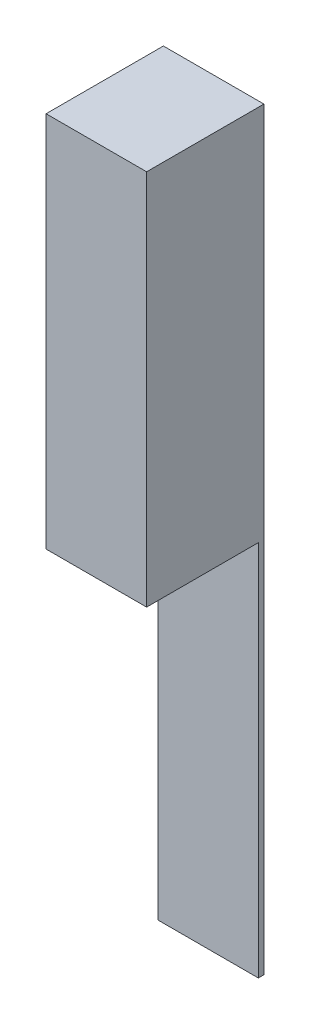
ISO-10303-21;
HEADER;
FILE_DESCRIPTION(('STEP AP214'),'2;1');
FILE_NAME('part.step','',(''),(''),'','','');
FILE_SCHEMA(('AUTOMOTIVE_DESIGN { 1 0 10303 214 1 1 1 1 }'));
ENDSEC;
DATA;
#1=APPLICATION_CONTEXT('core data for automotive mechanical design processes');
#2=APPLICATION_PROTOCOL_DEFINITION('international standard','automotive_design',2000,#1);
#3=PRODUCT_CONTEXT('',#1,'mechanical');
#4=PRODUCT('Part','Part','',(#3));
#5=PRODUCT_RELATED_PRODUCT_CATEGORY('part','',(#4));
#6=PRODUCT_DEFINITION_FORMATION('','',#4);
#7=PRODUCT_DEFINITION_CONTEXT('part definition',#1,'design');
#8=PRODUCT_DEFINITION('design','',#6,#7);
#9=PRODUCT_DEFINITION_SHAPE('','',#8);
#10=(LENGTH_UNIT() NAMED_UNIT(*) SI_UNIT(.MILLI.,.METRE.));
#11=(NAMED_UNIT(*) PLANE_ANGLE_UNIT() SI_UNIT($,.RADIAN.));
#12=(NAMED_UNIT(*) SI_UNIT($,.STERADIAN.) SOLID_ANGLE_UNIT());
#13=UNCERTAINTY_MEASURE_WITH_UNIT(LENGTH_MEASURE(1.E-05),#10,'distance_accuracy_value','');
#14=(GEOMETRIC_REPRESENTATION_CONTEXT(3) GLOBAL_UNCERTAINTY_ASSIGNED_CONTEXT((#13)) GLOBAL_UNIT_ASSIGNED_CONTEXT((#10,
#11,#12)) REPRESENTATION_CONTEXT('',''));
#15=CARTESIAN_POINT('',(0.,0.,0.));
#16=DIRECTION('',(0.,0.,1.));
#17=DIRECTION('',(1.,0.,0.));
#18=AXIS2_PLACEMENT_3D('',#15,#16,#17);
#19=CARTESIAN_POINT('',(-4.49276980892751,7.60454057591623,3.45));
#20=DIRECTION('',(1.,0.,0.));
#21=DIRECTION('',(0.,0.,-1.));
#22=AXIS2_PLACEMENT_3D('',#19,#20,#21);
#23=PLANE('',#22);
#24=DIRECTION('',(0.,-1.,0.));
#25=VECTOR('',#24,1.);
#26=CARTESIAN_POINT('',(-4.49276980892751,7.60454057591623,0.));
#27=LINE('',#26,#25);
#28=CARTESIAN_POINT('',(-4.49276980892751,7.60454057591623,0.));
#29=VERTEX_POINT('',#28);
#30=CARTESIAN_POINT('',(-4.49276980892751,-458.145459424084,0.));
#31=VERTEX_POINT('',#30);
#32=EDGE_CURVE('E93',#29,#31,#27,.T.);
#33=ORIENTED_EDGE('',*,*,#32,.T.);
#34=DIRECTION('',(0.,0.,-1.));
#35=VECTOR('',#34,1.);
#36=CARTESIAN_POINT('',(-4.49276980892751,-458.145459424084,3.45));
#37=LINE('',#36,#35);
#38=CARTESIAN_POINT('',(-4.49276980892751,-458.145459424084,3.45));
#39=VERTEX_POINT('',#38);
#40=EDGE_CURVE('E11',#39,#31,#37,.T.);
#41=ORIENTED_EDGE('',*,*,#40,.F.);
#42=DIRECTION('',(0.,-1.,0.));
#43=VECTOR('',#42,1.);
#44=CARTESIAN_POINT('',(-4.49276980892751,7.60454057591623,3.45));
#45=LINE('',#44,#43);
#46=CARTESIAN_POINT('',(-4.49276980892751,-225.270459424084,3.45));
#47=VERTEX_POINT('',#46);
#48=EDGE_CURVE('E86',#47,#39,#45,.T.);
#49=ORIENTED_EDGE('',*,*,#48,.F.);
#50=DIRECTION('',(0.,0.,-1.));
#51=VECTOR('',#50,1.);
#52=CARTESIAN_POINT('',(-4.49276980892751,-225.270459424084,72.45));
#53=LINE('',#52,#51);
#54=CARTESIAN_POINT('',(-4.49276980892751,-225.270459424084,72.45));
#55=VERTEX_POINT('',#54);
#56=EDGE_CURVE('E101',#55,#47,#53,.T.);
#57=ORIENTED_EDGE('',*,*,#56,.F.);
#58=DIRECTION('',(0.,-1.,0.));
#59=VECTOR('',#58,1.);
#60=CARTESIAN_POINT('',(-4.49276980892751,7.60454057591623,72.45));
#61=LINE('',#60,#59);
#62=CARTESIAN_POINT('',(-4.49276980892751,7.60454057591623,72.45));
#63=VERTEX_POINT('',#62);
#64=EDGE_CURVE('E96',#63,#55,#61,.T.);
#65=ORIENTED_EDGE('',*,*,#64,.F.);
#66=DIRECTION('',(0.,0.,-1.));
#67=VECTOR('',#66,1.);
#68=CARTESIAN_POINT('',(-4.49276980892751,7.60454057591623,3.45));
#69=LINE('',#68,#67);
#70=EDGE_CURVE('E79',#63,#29,#69,.T.);
#71=ORIENTED_EDGE('',*,*,#70,.T.);
#72=EDGE_LOOP('',(#33,#41,#49,#57,#65,#71));
#73=FACE_BOUND('',#72,.T.);
#74=ADVANCED_FACE('F33',(#73),#23,.F.);
#75=CARTESIAN_POINT('',(-4.49276980892751,-458.145459424084,3.45));
#76=DIRECTION('',(0.,1.,0.));
#77=DIRECTION('',(0.,0.,1.));
#78=AXIS2_PLACEMENT_3D('',#75,#76,#77);
#79=PLANE('',#78);
#80=DIRECTION('',(1.,0.,0.));
#81=VECTOR('',#80,1.);
#82=CARTESIAN_POINT('',(-4.49276980892751,-458.145459424084,0.));
#83=LINE('',#82,#81);
#84=CARTESIAN_POINT('',(57.6072301910725,-458.145459424084,0.));
#85=VERTEX_POINT('',#84);
#86=EDGE_CURVE('E100',#31,#85,#83,.T.);
#87=ORIENTED_EDGE('',*,*,#86,.T.);
#88=DIRECTION('',(0.,0.,-1.));
#89=VECTOR('',#88,1.);
#90=CARTESIAN_POINT('',(57.6072301910725,-458.145459424084,3.45));
#91=LINE('',#90,#89);
#92=CARTESIAN_POINT('',(57.6072301910725,-458.145459424084,3.45));
#93=VERTEX_POINT('',#92);
#94=EDGE_CURVE('E41',#93,#85,#91,.T.);
#95=ORIENTED_EDGE('',*,*,#94,.F.);
#96=DIRECTION('',(1.,0.,0.));
#97=VECTOR('',#96,1.);
#98=CARTESIAN_POINT('',(-4.49276980892751,-458.145459424084,3.45));
#99=LINE('',#98,#97);
#100=EDGE_CURVE('E55',#39,#93,#99,.T.);
#101=ORIENTED_EDGE('',*,*,#100,.F.);
#102=ORIENTED_EDGE('',*,*,#40,.T.);
#103=EDGE_LOOP('',(#87,#95,#101,#102));
#104=FACE_BOUND('',#103,.T.);
#105=ADVANCED_FACE('F149',(#104),#79,.F.);
#106=CARTESIAN_POINT('',(57.6072301910725,7.60454057591623,3.45));
#107=DIRECTION('',(-1.,0.,0.));
#108=DIRECTION('',(0.,0.,1.));
#109=AXIS2_PLACEMENT_3D('',#106,#107,#108);
#110=PLANE('',#109);
#111=DIRECTION('',(0.,1.,0.));
#112=VECTOR('',#111,1.);
#113=CARTESIAN_POINT('',(57.6072301910725,7.60454057591623,0.));
#114=LINE('',#113,#112);
#115=CARTESIAN_POINT('',(57.6072301910725,7.60454057591623,0.));
#116=VERTEX_POINT('',#115);
#117=EDGE_CURVE('E87',#85,#116,#114,.T.);
#118=ORIENTED_EDGE('',*,*,#117,.T.);
#119=DIRECTION('',(0.,0.,-1.));
#120=VECTOR('',#119,1.);
#121=CARTESIAN_POINT('',(57.6072301910725,7.60454057591623,3.45));
#122=LINE('',#121,#120);
#123=CARTESIAN_POINT('',(57.6072301910725,7.60454057591623,72.45));
#124=VERTEX_POINT('',#123);
#125=EDGE_CURVE('E82',#124,#116,#122,.T.);
#126=ORIENTED_EDGE('',*,*,#125,.F.);
#127=DIRECTION('',(0.,1.,0.));
#128=VECTOR('',#127,1.);
#129=CARTESIAN_POINT('',(57.6072301910725,7.60454057591623,72.45));
#130=LINE('',#129,#128);
#131=CARTESIAN_POINT('',(57.6072301910725,-225.270459424084,72.45));
#132=VERTEX_POINT('',#131);
#133=EDGE_CURVE('E135',#132,#124,#130,.T.);
#134=ORIENTED_EDGE('',*,*,#133,.F.);
#135=DIRECTION('',(0.,0.,-1.));
#136=VECTOR('',#135,1.);
#137=CARTESIAN_POINT('',(57.6072301910725,-225.270459424084,72.45));
#138=LINE('',#137,#136);
#139=CARTESIAN_POINT('',(57.6072301910725,-225.270459424084,3.45));
#140=VERTEX_POINT('',#139);
#141=EDGE_CURVE('E105',#132,#140,#138,.T.);
#142=ORIENTED_EDGE('',*,*,#141,.T.);
#143=DIRECTION('',(0.,1.,0.));
#144=VECTOR('',#143,1.);
#145=CARTESIAN_POINT('',(57.6072301910725,7.60454057591623,3.45));
#146=LINE('',#145,#144);
#147=EDGE_CURVE('E97',#93,#140,#146,.T.);
#148=ORIENTED_EDGE('',*,*,#147,.F.);
#149=ORIENTED_EDGE('',*,*,#94,.T.);
#150=EDGE_LOOP('',(#118,#126,#134,#142,#148,#149));
#151=FACE_BOUND('',#150,.T.);
#152=ADVANCED_FACE('F133',(#151),#110,.F.);
#153=CARTESIAN_POINT('',(-4.49276980892751,7.60454057591623,3.45));
#154=DIRECTION('',(0.,-1.,0.));
#155=DIRECTION('',(0.,0.,-1.));
#156=AXIS2_PLACEMENT_3D('',#153,#154,#155);
#157=PLANE('',#156);
#158=DIRECTION('',(-1.,0.,0.));
#159=VECTOR('',#158,1.);
#160=CARTESIAN_POINT('',(-4.49276980892751,7.60454057591623,0.));
#161=LINE('',#160,#159);
#162=EDGE_CURVE('E75',#116,#29,#161,.T.);
#163=ORIENTED_EDGE('',*,*,#162,.T.);
#164=ORIENTED_EDGE('',*,*,#70,.F.);
#165=DIRECTION('',(-1.,0.,0.));
#166=VECTOR('',#165,1.);
#167=CARTESIAN_POINT('',(-4.49276980892751,7.60454057591623,72.45));
#168=LINE('',#167,#166);
#169=EDGE_CURVE('E136',#124,#63,#168,.T.);
#170=ORIENTED_EDGE('',*,*,#169,.F.);
#171=ORIENTED_EDGE('',*,*,#125,.T.);
#172=EDGE_LOOP('',(#163,#164,#170,#171));
#173=FACE_BOUND('',#172,.T.);
#174=ADVANCED_FACE('F77',(#173),#157,.F.);
#175=CARTESIAN_POINT('',(0.,0.,3.45));
#176=DIRECTION('',(0.,0.,1.));
#177=DIRECTION('',(1.,0.,0.));
#178=AXIS2_PLACEMENT_3D('',#175,#176,#177);
#179=PLANE('',#178);
#180=DIRECTION('',(1.,0.,0.));
#181=VECTOR('',#180,1.);
#182=CARTESIAN_POINT('',(-4.49276980892751,-225.270459424084,3.45));
#183=LINE('',#182,#181);
#184=EDGE_CURVE('E49',#47,#140,#183,.T.);
#185=ORIENTED_EDGE('',*,*,#184,.F.);
#186=ORIENTED_EDGE('',*,*,#48,.T.);
#187=ORIENTED_EDGE('',*,*,#100,.T.);
#188=ORIENTED_EDGE('',*,*,#147,.T.);
#189=EDGE_LOOP('',(#185,#186,#187,#188));
#190=FACE_BOUND('',#189,.T.);
#191=ADVANCED_FACE('F123',(#190),#179,.T.);
#192=CARTESIAN_POINT('',(0.,0.,0.));
#193=DIRECTION('',(0.,0.,1.));
#194=DIRECTION('',(1.,0.,0.));
#195=AXIS2_PLACEMENT_3D('',#192,#193,#194);
#196=PLANE('',#195);
#197=ORIENTED_EDGE('',*,*,#32,.F.);
#198=ORIENTED_EDGE('',*,*,#162,.F.);
#199=ORIENTED_EDGE('',*,*,#117,.F.);
#200=ORIENTED_EDGE('',*,*,#86,.F.);
#201=EDGE_LOOP('',(#197,#198,#199,#200));
#202=FACE_BOUND('',#201,.T.);
#203=ADVANCED_FACE('F99',(#202),#196,.F.);
#204=CARTESIAN_POINT('',(-4.49276980892751,-225.270459424084,72.45));
#205=DIRECTION('',(0.,1.,0.));
#206=DIRECTION('',(0.,0.,1.));
#207=AXIS2_PLACEMENT_3D('',#204,#205,#206);
#208=PLANE('',#207);
#209=ORIENTED_EDGE('',*,*,#184,.T.);
#210=ORIENTED_EDGE('',*,*,#141,.F.);
#211=DIRECTION('',(1.,0.,0.));
#212=VECTOR('',#211,1.);
#213=CARTESIAN_POINT('',(-4.49276980892751,-225.270459424084,72.45));
#214=LINE('',#213,#212);
#215=EDGE_CURVE('E141',#55,#132,#214,.T.);
#216=ORIENTED_EDGE('',*,*,#215,.F.);
#217=ORIENTED_EDGE('',*,*,#56,.T.);
#218=EDGE_LOOP('',(#209,#210,#216,#217));
#219=FACE_BOUND('',#218,.T.);
#220=ADVANCED_FACE('F129',(#219),#208,.F.);
#221=CARTESIAN_POINT('',(0.,0.,72.45));
#222=DIRECTION('',(0.,0.,1.));
#223=DIRECTION('',(1.,0.,0.));
#224=AXIS2_PLACEMENT_3D('',#221,#222,#223);
#225=PLANE('',#224);
#226=ORIENTED_EDGE('',*,*,#64,.T.);
#227=ORIENTED_EDGE('',*,*,#215,.T.);
#228=ORIENTED_EDGE('',*,*,#133,.T.);
#229=ORIENTED_EDGE('',*,*,#169,.T.);
#230=EDGE_LOOP('',(#226,#227,#228,#229));
#231=FACE_BOUND('',#230,.T.);
#232=ADVANCED_FACE('F146',(#231),#225,.T.);
#233=CLOSED_SHELL('',(#74,#105,#152,#174,#191,#203,#220,#232));
#234=MANIFOLD_SOLID_BREP('B2',#233);
#235=ADVANCED_BREP_SHAPE_REPRESENTATION('',(#18,#234),#14);
#236=SHAPE_DEFINITION_REPRESENTATION(#9,#235);
ENDSEC;
END-ISO-10303-21;
